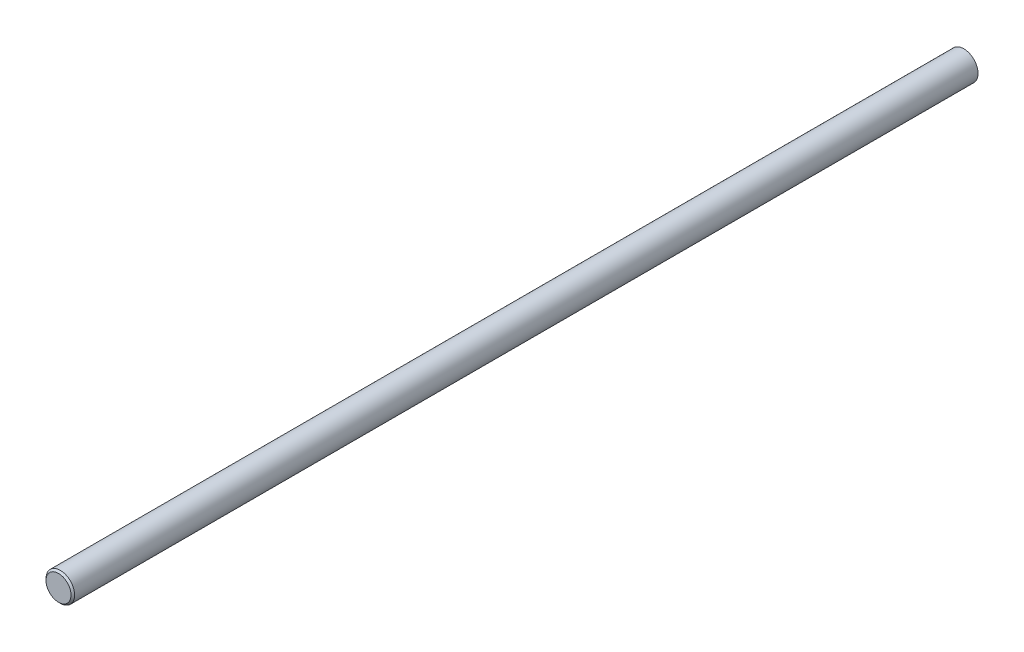
ISO-10303-21;
HEADER;
FILE_DESCRIPTION(('STEP AP214'),'2;1');
FILE_NAME('part.step','',(''),(''),'','','');
FILE_SCHEMA(('AUTOMOTIVE_DESIGN { 1 0 10303 214 1 1 1 1 }'));
ENDSEC;
DATA;
#1=APPLICATION_CONTEXT('core data for automotive mechanical design processes');
#2=APPLICATION_PROTOCOL_DEFINITION('international standard','automotive_design',2000,#1);
#3=PRODUCT_CONTEXT('',#1,'mechanical');
#4=PRODUCT('Part','Part','',(#3));
#5=PRODUCT_RELATED_PRODUCT_CATEGORY('part','',(#4));
#6=PRODUCT_DEFINITION_FORMATION('','',#4);
#7=PRODUCT_DEFINITION_CONTEXT('part definition',#1,'design');
#8=PRODUCT_DEFINITION('design','',#6,#7);
#9=PRODUCT_DEFINITION_SHAPE('','',#8);
#10=(LENGTH_UNIT() NAMED_UNIT(*) SI_UNIT(.MILLI.,.METRE.));
#11=(NAMED_UNIT(*) PLANE_ANGLE_UNIT() SI_UNIT($,.RADIAN.));
#12=(NAMED_UNIT(*) SI_UNIT($,.STERADIAN.) SOLID_ANGLE_UNIT());
#13=UNCERTAINTY_MEASURE_WITH_UNIT(LENGTH_MEASURE(1.E-05),#10,'distance_accuracy_value','');
#14=(GEOMETRIC_REPRESENTATION_CONTEXT(3) GLOBAL_UNCERTAINTY_ASSIGNED_CONTEXT((#13)) GLOBAL_UNIT_ASSIGNED_CONTEXT((#10,
#11,#12)) REPRESENTATION_CONTEXT('',''));
#15=CARTESIAN_POINT('',(0.,0.,0.));
#16=DIRECTION('',(0.,0.,1.));
#17=DIRECTION('',(1.,0.,0.));
#18=AXIS2_PLACEMENT_3D('',#15,#16,#17);
#19=CARTESIAN_POINT('',(0.,0.,152.4));
#20=DIRECTION('',(0.,0.,-1.));
#21=DIRECTION('',(-1.,0.,0.));
#22=AXIS2_PLACEMENT_3D('',#19,#20,#21);
#23=CYLINDRICAL_SURFACE('',#22,3.);
#24=CARTESIAN_POINT('',(0.,0.,-37.6));
#25=DIRECTION('',(0.,0.,1.));
#26=DIRECTION('',(1.,0.,0.));
#27=AXIS2_PLACEMENT_3D('',#24,#25,#26);
#28=CIRCLE('',#27,3.);
#29=CARTESIAN_POINT('',(-3.,0.,-37.6));
#30=VERTEX_POINT('',#29);
#31=EDGE_CURVE('E50',#30,#30,#28,.T.);
#32=CARTESIAN_POINT('',(0.,0.,152.025));
#33=DIRECTION('',(0.,0.,1.));
#34=DIRECTION('',(1.,0.,0.));
#35=AXIS2_PLACEMENT_3D('',#32,#33,#34);
#36=CIRCLE('',#35,3.);
#37=CARTESIAN_POINT('',(-3.,0.,152.025));
#38=VERTEX_POINT('',#37);
#39=EDGE_CURVE('E45',#38,#38,#36,.F.);
#40=CARTESIAN_POINT('',(-3.,0.,-37.6));
#41=CARTESIAN_POINT('',(-3.,0.,-35.6247395833334));
#42=CARTESIAN_POINT('',(-3.,0.,-33.6494791666667));
#43=CARTESIAN_POINT('',(-3.,0.,-29.6989583333333));
#44=CARTESIAN_POINT('',(-3.,0.,-27.7236979166667));
#45=CARTESIAN_POINT('',(-3.,0.,-23.7731770833333));
#46=CARTESIAN_POINT('',(-3.,0.,-21.7979166666667));
#47=CARTESIAN_POINT('',(-3.,0.,-17.8473958333333));
#48=CARTESIAN_POINT('',(-3.,0.,-15.8721354166667));
#49=CARTESIAN_POINT('',(-3.,0.,-11.9216145833333));
#50=CARTESIAN_POINT('',(-3.,0.,-9.94635416666666));
#51=CARTESIAN_POINT('',(-3.,0.,-5.99583333333332));
#52=CARTESIAN_POINT('',(-3.,0.,-4.02057291666665));
#53=CARTESIAN_POINT('',(-3.,0.,-0.0700520833333091));
#54=CARTESIAN_POINT('',(-3.,0.,1.90520833333336));
#55=CARTESIAN_POINT('',(-3.,0.,5.85572916666669));
#56=CARTESIAN_POINT('',(-3.,0.,7.83098958333335));
#57=CARTESIAN_POINT('',(-3.,0.,11.7815104166667));
#58=CARTESIAN_POINT('',(-3.,0.,13.7567708333334));
#59=CARTESIAN_POINT('',(-3.,0.,17.7072916666667));
#60=CARTESIAN_POINT('',(-3.,0.,19.6825520833334));
#61=CARTESIAN_POINT('',(-3.,0.,23.6330729166667));
#62=CARTESIAN_POINT('',(-3.,0.,25.6083333333334));
#63=CARTESIAN_POINT('',(-3.,0.,29.5588541666667));
#64=CARTESIAN_POINT('',(-3.,0.,31.5341145833334));
#65=CARTESIAN_POINT('',(-3.,0.,35.4846354166667));
#66=CARTESIAN_POINT('',(-3.,0.,37.4598958333334));
#67=CARTESIAN_POINT('',(-3.,0.,41.4104166666667));
#68=CARTESIAN_POINT('',(-3.,0.,43.3856770833334));
#69=CARTESIAN_POINT('',(-3.,0.,47.3361979166667));
#70=CARTESIAN_POINT('',(-3.,0.,49.3114583333334));
#71=CARTESIAN_POINT('',(-3.,0.,53.2619791666667));
#72=CARTESIAN_POINT('',(-3.,0.,55.2372395833334));
#73=CARTESIAN_POINT('',(-3.,0.,59.1877604166667));
#74=CARTESIAN_POINT('',(-3.,0.,61.1630208333334));
#75=CARTESIAN_POINT('',(-3.,0.,65.1135416666667));
#76=CARTESIAN_POINT('',(-3.,0.,67.0888020833334));
#77=CARTESIAN_POINT('',(-3.,0.,71.0393229166667));
#78=CARTESIAN_POINT('',(-3.,0.,73.0145833333334));
#79=CARTESIAN_POINT('',(-3.,0.,76.9651041666668));
#80=CARTESIAN_POINT('',(-3.,0.,78.9403645833334));
#81=CARTESIAN_POINT('',(-3.,0.,82.8908854166667));
#82=CARTESIAN_POINT('',(-3.,0.,84.8661458333334));
#83=CARTESIAN_POINT('',(-3.,0.,88.8166666666668));
#84=CARTESIAN_POINT('',(-3.,0.,90.7919270833334));
#85=CARTESIAN_POINT('',(-3.,0.,94.7424479166668));
#86=CARTESIAN_POINT('',(-3.,0.,96.7177083333334));
#87=CARTESIAN_POINT('',(-3.,0.,100.668229166667));
#88=CARTESIAN_POINT('',(-3.,0.,102.643489583333));
#89=CARTESIAN_POINT('',(-3.,0.,106.594010416667));
#90=CARTESIAN_POINT('',(-3.,0.,108.569270833333));
#91=CARTESIAN_POINT('',(-3.,0.,112.519791666667));
#92=CARTESIAN_POINT('',(-3.,0.,114.495052083333));
#93=CARTESIAN_POINT('',(-3.,0.,118.445572916667));
#94=CARTESIAN_POINT('',(-3.,0.,120.420833333333));
#95=CARTESIAN_POINT('',(-3.,0.,124.371354166667));
#96=CARTESIAN_POINT('',(-3.,0.,126.346614583333));
#97=CARTESIAN_POINT('',(-3.,0.,130.297135416667));
#98=CARTESIAN_POINT('',(-3.,0.,132.272395833333));
#99=CARTESIAN_POINT('',(-3.,0.,136.222916666667));
#100=CARTESIAN_POINT('',(-3.,0.,138.198177083333));
#101=CARTESIAN_POINT('',(-3.,0.,142.148697916667));
#102=CARTESIAN_POINT('',(-3.,0.,144.123958333333));
#103=CARTESIAN_POINT('',(-3.,0.,148.074479166667));
#104=CARTESIAN_POINT('',(-3.,0.,150.049739583333));
#105=CARTESIAN_POINT('',(-3.,0.,152.025));
#106=B_SPLINE_CURVE_WITH_KNOTS('',3,(#40,#41,#42,#43,#44,#45,#46,#47,#48,#49,#50,#51,#52,#53,
#54,#55,#56,#57,#58,#59,#60,#61,#62,#63,#64,#65,#66,#67,#68,#69,#70,#71,#72,#73,#74,#75,#76,#77,
#78,#79,#80,#81,#82,#83,#84,#85,#86,#87,#88,#89,#90,#91,#92,#93,#94,#95,#96,#97,#98,#99,#100,
#101,#102,#103,#104,#105),.UNSPECIFIED.,.F.,.F.,(4,2,2,2,2,2,2,2,2,2,2,2,2,2,2,2,2,2,2,2,2,2,2,
2,2,2,2,2,2,2,2,2,4),(0.,5.92578125000001,11.8515625,17.77734375,23.703125,29.62890625,
35.5546875,41.4804687500001,47.40625,53.33203125,59.2578125000001,65.1835937500001,
71.1093750000001,77.0351562500001,82.9609375000001,88.8867187500001,94.8125000000001,
100.73828125,106.6640625,112.58984375,118.515625,124.44140625,130.3671875,136.29296875,
142.21875,148.14453125,154.0703125,159.99609375,165.921875,171.84765625,177.7734375,
183.69921875,189.625),.UNSPECIFIED.);
#107=EDGE_CURVE('BSEAM37',#30,#38,#106,.T.);
#108=ORIENTED_EDGE('',*,*,#31,.T.);
#109=ORIENTED_EDGE('',*,*,#39,.T.);
#110=ORIENTED_EDGE('',*,*,#107,.T.);
#111=ORIENTED_EDGE('',*,*,#107,.F.);
#112=EDGE_LOOP('',(#108,#110,#109,#111));
#113=FACE_BOUND('',#112,.T.);
#114=ADVANCED_FACE('F37',(#113),#23,.T.);
#115=CARTESIAN_POINT('',(0.,0.,152.4));
#116=DIRECTION('',(0.,0.,1.));
#117=DIRECTION('',(1.,0.,0.));
#118=AXIS2_PLACEMENT_3D('',#115,#116,#117);
#119=PLANE('',#118);
#120=CARTESIAN_POINT('',(0.,0.,152.4));
#121=DIRECTION('',(0.,0.,1.));
#122=DIRECTION('',(1.,0.,0.));
#123=AXIS2_PLACEMENT_3D('',#120,#121,#122);
#124=CIRCLE('',#123,2.62500000000018);
#125=CARTESIAN_POINT('',(2.62500000000018,0.,152.4));
#126=VERTEX_POINT('',#125);
#127=EDGE_CURVE('E10',#126,#126,#124,.T.);
#128=ORIENTED_EDGE('',*,*,#127,.T.);
#129=EDGE_LOOP('',(#128));
#130=FACE_BOUND('',#129,.T.);
#131=ADVANCED_FACE('F65',(#130),#119,.T.);
#132=CARTESIAN_POINT('',(0.,0.,152.4));
#133=DIRECTION('',(0.,0.,-1.));
#134=DIRECTION('',(-1.,0.,0.));
#135=AXIS2_PLACEMENT_3D('',#132,#133,#134);
#136=CONICAL_SURFACE('',#135,2.62500000000018,0.785398163397446);
#137=ORIENTED_EDGE('',*,*,#39,.F.);
#138=EDGE_LOOP('',(#137));
#139=FACE_BOUND('',#138,.T.);
#140=ORIENTED_EDGE('',*,*,#127,.F.);
#141=EDGE_LOOP('',(#140));
#142=FACE_BOUND('',#141,.T.);
#143=ADVANCED_FACE('F39',(#139,#142),#136,.T.);
#144=CARTESIAN_POINT('',(0.,0.,-37.6));
#145=DIRECTION('',(0.,0.,1.));
#146=DIRECTION('',(1.,0.,0.));
#147=AXIS2_PLACEMENT_3D('',#144,#145,#146);
#148=PLANE('',#147);
#149=ORIENTED_EDGE('',*,*,#31,.F.);
#150=EDGE_LOOP('',(#149));
#151=FACE_BOUND('',#150,.T.);
#152=ADVANCED_FACE('F59',(#151),#148,.F.);
#153=CLOSED_SHELL('',(#114,#131,#143,#152));
#154=MANIFOLD_SOLID_BREP('B2',#153);
#155=ADVANCED_BREP_SHAPE_REPRESENTATION('',(#18,#154),#14);
#156=SHAPE_DEFINITION_REPRESENTATION(#9,#155);
ENDSEC;
END-ISO-10303-21;
